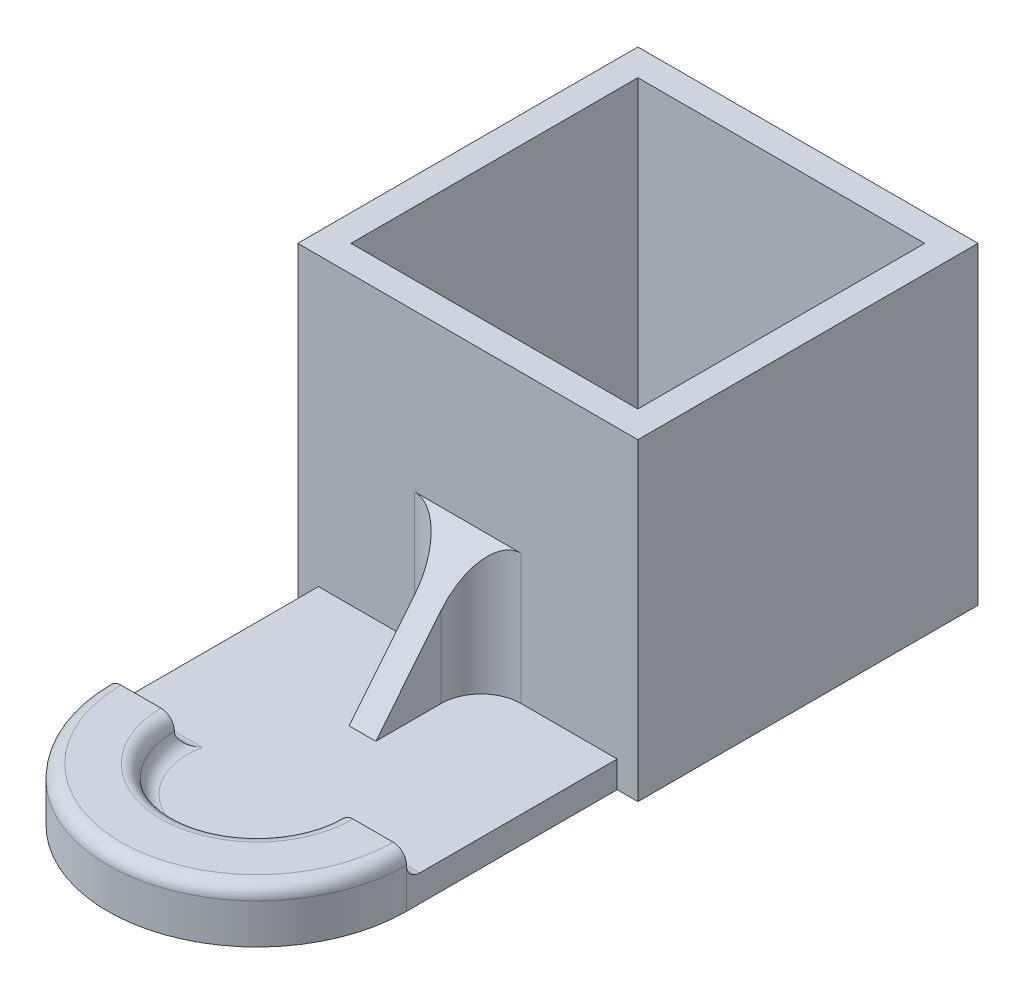
ISO-10303-21;
HEADER;
FILE_DESCRIPTION(('STEP AP214'),'2;1');
FILE_NAME('part.step','',(''),(''),'','','');
FILE_SCHEMA(('AUTOMOTIVE_DESIGN { 1 0 10303 214 1 1 1 1 }'));
ENDSEC;
DATA;
#1=APPLICATION_CONTEXT('core data for automotive mechanical design processes');
#2=APPLICATION_PROTOCOL_DEFINITION('international standard','automotive_design',2000,#1);
#3=PRODUCT_CONTEXT('',#1,'mechanical');
#4=PRODUCT('Part','Part','',(#3));
#5=PRODUCT_RELATED_PRODUCT_CATEGORY('part','',(#4));
#6=PRODUCT_DEFINITION_FORMATION('','',#4);
#7=PRODUCT_DEFINITION_CONTEXT('part definition',#1,'design');
#8=PRODUCT_DEFINITION('design','',#6,#7);
#9=PRODUCT_DEFINITION_SHAPE('','',#8);
#10=(LENGTH_UNIT() NAMED_UNIT(*) SI_UNIT(.MILLI.,.METRE.));
#11=(NAMED_UNIT(*) PLANE_ANGLE_UNIT() SI_UNIT($,.RADIAN.));
#12=(NAMED_UNIT(*) SI_UNIT($,.STERADIAN.) SOLID_ANGLE_UNIT());
#13=UNCERTAINTY_MEASURE_WITH_UNIT(LENGTH_MEASURE(1.E-05),#10,'distance_accuracy_value','');
#14=(GEOMETRIC_REPRESENTATION_CONTEXT(3) GLOBAL_UNCERTAINTY_ASSIGNED_CONTEXT((#13)) GLOBAL_UNIT_ASSIGNED_CONTEXT((#10,
#11,#12)) REPRESENTATION_CONTEXT('',''));
#15=CARTESIAN_POINT('',(0.,0.,0.));
#16=DIRECTION('',(0.,0.,1.));
#17=DIRECTION('',(1.,0.,0.));
#18=AXIS2_PLACEMENT_3D('',#15,#16,#17);
#19=CARTESIAN_POINT('',(0.,21.5443469,2.));
#20=DIRECTION('',(0.,0.,-1.));
#21=DIRECTION('',(-1.,0.,0.));
#22=AXIS2_PLACEMENT_3D('',#19,#20,#21);
#23=PLANE('',#22);
#24=DIRECTION('',(-1.,0.,0.));
#25=VECTOR('',#24,1.);
#26=CARTESIAN_POINT('',(11.77217345,9.77217345,2.));
#27=LINE('',#26,#25);
#28=CARTESIAN_POINT('',(14.77217345,9.77217345,2.));
#29=VERTEX_POINT('',#28);
#30=CARTESIAN_POINT('',(6.77217345,9.77217345,2.));
#31=VERTEX_POINT('',#30);
#32=EDGE_CURVE('E232',#29,#31,#27,.T.);
#33=ORIENTED_EDGE('',*,*,#32,.F.);
#34=DIRECTION('',(0.,1.,0.));
#35=VECTOR('',#34,1.);
#36=CARTESIAN_POINT('',(14.77217345,0.,2.));
#37=LINE('',#36,#35);
#38=CARTESIAN_POINT('',(14.77217345,0.,2.));
#39=VERTEX_POINT('',#38);
#40=EDGE_CURVE('E374',#29,#39,#37,.F.);
#41=ORIENTED_EDGE('',*,*,#40,.T.);
#42=DIRECTION('',(-1.,0.,0.));
#43=VECTOR('',#42,1.);
#44=CARTESIAN_POINT('',(0.,0.,2.));
#45=LINE('',#44,#43);
#46=CARTESIAN_POINT('',(21.9876055524861,0.,2.));
#47=VERTEX_POINT('',#46);
#48=EDGE_CURVE('E365',#47,#39,#45,.T.);
#49=ORIENTED_EDGE('',*,*,#48,.F.);
#50=DIRECTION('',(0.,-1.,0.));
#51=VECTOR('',#50,1.);
#52=CARTESIAN_POINT('',(21.9876055524861,0.,2.));
#53=LINE('',#52,#51);
#54=CARTESIAN_POINT('',(21.9876055524861,-2.,2.));
#55=VERTEX_POINT('',#54);
#56=EDGE_CURVE('E258',#47,#55,#53,.T.);
#57=ORIENTED_EDGE('',*,*,#56,.T.);
#58=DIRECTION('',(-1.,0.,0.));
#59=VECTOR('',#58,1.);
#60=CARTESIAN_POINT('',(23.5443469,-2.,2.));
#61=LINE('',#60,#59);
#62=CARTESIAN_POINT('',(23.5443469,-2.,2.));
#63=VERTEX_POINT('',#62);
#64=EDGE_CURVE('E281',#63,#55,#61,.T.);
#65=ORIENTED_EDGE('',*,*,#64,.F.);
#66=DIRECTION('',(0.,-1.,0.));
#67=VECTOR('',#66,1.);
#68=CARTESIAN_POINT('',(23.5443469,21.5443469,2.));
#69=LINE('',#68,#67);
#70=CARTESIAN_POINT('',(23.5443469,21.5443469,2.));
#71=VERTEX_POINT('',#70);
#72=EDGE_CURVE('E357',#71,#63,#69,.T.);
#73=ORIENTED_EDGE('',*,*,#72,.F.);
#74=DIRECTION('',(1.,0.,0.));
#75=VECTOR('',#74,1.);
#76=CARTESIAN_POINT('',(0.,21.5443469,2.));
#77=LINE('',#76,#75);
#78=CARTESIAN_POINT('',(-2.,21.5443469,2.));
#79=VERTEX_POINT('',#78);
#80=EDGE_CURVE('E342',#79,#71,#77,.T.);
#81=ORIENTED_EDGE('',*,*,#80,.F.);
#82=DIRECTION('',(0.,-1.,0.));
#83=VECTOR('',#82,1.);
#84=CARTESIAN_POINT('',(-2.,21.5443469,2.));
#85=LINE('',#84,#83);
#86=CARTESIAN_POINT('',(-2.,-2.,2.));
#87=VERTEX_POINT('',#86);
#88=EDGE_CURVE('E360',#79,#87,#85,.T.);
#89=ORIENTED_EDGE('',*,*,#88,.T.);
#90=CARTESIAN_POINT('',(-0.443258652486052,-2.,2.));
#91=VERTEX_POINT('',#90);
#92=EDGE_CURVE('E272',#91,#87,#61,.T.);
#93=ORIENTED_EDGE('',*,*,#92,.F.);
#94=DIRECTION('',(0.,-1.,0.));
#95=VECTOR('',#94,1.);
#96=CARTESIAN_POINT('',(-0.443258652486053,0.,2.));
#97=LINE('',#96,#95);
#98=CARTESIAN_POINT('',(-0.443258652486053,0.,2.));
#99=VERTEX_POINT('',#98);
#100=EDGE_CURVE('E268',#99,#91,#97,.T.);
#101=ORIENTED_EDGE('',*,*,#100,.F.);
#102=CARTESIAN_POINT('',(6.77217345,0.,2.));
#103=VERTEX_POINT('',#102);
#104=EDGE_CURVE('E364',#103,#99,#45,.T.);
#105=ORIENTED_EDGE('',*,*,#104,.F.);
#106=DIRECTION('',(0.,1.,0.));
#107=VECTOR('',#106,1.);
#108=CARTESIAN_POINT('',(6.77217345,21.5443469,2.));
#109=LINE('',#108,#107);
#110=EDGE_CURVE('E370',#103,#31,#109,.T.);
#111=ORIENTED_EDGE('',*,*,#110,.T.);
#112=EDGE_LOOP('',(#33,#41,#49,#57,#65,#73,#81,#89,#93,#101,#105,#111));
#113=FACE_BOUND('',#112,.T.);
#114=ADVANCED_FACE('F63',(#113),#23,.F.);
#115=CARTESIAN_POINT('',(10.77217345,0.,2.));
#116=DIRECTION('',(0.,-1.,0.));
#117=DIRECTION('',(0.,0.,-1.));
#118=AXIS2_PLACEMENT_3D('',#115,#116,#117);
#119=PLANE('',#118);
#120=CARTESIAN_POINT('',(10.77217345,0.,17.8235518365));
#121=DIRECTION('',(0.,-1.,0.));
#122=DIRECTION('',(0.,0.,-1.));
#123=AXIS2_PLACEMENT_3D('',#120,#121,#122);
#124=CIRCLE('',#123,5.21543210248605);
#125=CARTESIAN_POINT('',(5.65350838812673,0.,16.8235518365));
#126=VERTEX_POINT('',#125);
#127=CARTESIAN_POINT('',(15.8908385118733,0.,16.8235518365));
#128=VERTEX_POINT('',#127);
#129=EDGE_CURVE('E391',#126,#128,#124,.F.);
#130=ORIENTED_EDGE('',*,*,#129,.T.);
#131=DIRECTION('',(1.,0.,0.));
#132=VECTOR('',#131,1.);
#133=CARTESIAN_POINT('',(10.77217345,0.,16.8235518365));
#134=LINE('',#133,#132);
#135=CARTESIAN_POINT('',(21.9876055524861,0.,16.8235518365));
#136=VERTEX_POINT('',#135);
#137=EDGE_CURVE('E397',#128,#136,#134,.T.);
#138=ORIENTED_EDGE('',*,*,#137,.T.);
#139=DIRECTION('',(0.,0.,1.));
#140=VECTOR('',#139,1.);
#141=CARTESIAN_POINT('',(21.9876055524861,0.,2.));
#142=LINE('',#141,#140);
#143=EDGE_CURVE('E250',#47,#136,#142,.T.);
#144=ORIENTED_EDGE('',*,*,#143,.F.);
#145=ORIENTED_EDGE('',*,*,#48,.T.);
#146=CARTESIAN_POINT('',(14.77217345,0.,5.));
#147=DIRECTION('',(0.,-1.,0.));
#148=DIRECTION('',(0.,0.,-1.));
#149=AXIS2_PLACEMENT_3D('',#146,#147,#148);
#150=CIRCLE('',#149,3.);
#151=CARTESIAN_POINT('',(11.77217345,0.,5.));
#152=VERTEX_POINT('',#151);
#153=EDGE_CURVE('E237',#39,#152,#150,.F.);
#154=ORIENTED_EDGE('',*,*,#153,.T.);
#155=DIRECTION('',(0.,0.,-1.));
#156=VECTOR('',#155,1.);
#157=CARTESIAN_POINT('',(11.77217345,0.,2.));
#158=LINE('',#157,#156);
#159=CARTESIAN_POINT('',(11.77217345,0.,9.91177591824999));
#160=VERTEX_POINT('',#159);
#161=EDGE_CURVE('E215',#160,#152,#158,.T.);
#162=ORIENTED_EDGE('',*,*,#161,.F.);
#163=DIRECTION('',(-1.,0.,0.));
#164=VECTOR('',#163,1.);
#165=CARTESIAN_POINT('',(11.77217345,0.,9.91177591824999));
#166=LINE('',#165,#164);
#167=CARTESIAN_POINT('',(9.77217345,0.,9.91177591824999));
#168=VERTEX_POINT('',#167);
#169=EDGE_CURVE('E224',#160,#168,#166,.T.);
#170=ORIENTED_EDGE('',*,*,#169,.T.);
#171=DIRECTION('',(0.,0.,-1.));
#172=VECTOR('',#171,1.);
#173=CARTESIAN_POINT('',(9.77217345,0.,2.));
#174=LINE('',#173,#172);
#175=CARTESIAN_POINT('',(9.77217345,0.,5.));
#176=VERTEX_POINT('',#175);
#177=EDGE_CURVE('E221',#168,#176,#174,.T.);
#178=ORIENTED_EDGE('',*,*,#177,.T.);
#179=CARTESIAN_POINT('',(6.77217345,0.,5.));
#180=DIRECTION('',(0.,-1.,0.));
#181=DIRECTION('',(0.,0.,-1.));
#182=AXIS2_PLACEMENT_3D('',#179,#180,#181);
#183=CIRCLE('',#182,3.);
#184=EDGE_CURVE('E377',#176,#103,#183,.F.);
#185=ORIENTED_EDGE('',*,*,#184,.T.);
#186=ORIENTED_EDGE('',*,*,#104,.T.);
#187=DIRECTION('',(0.,0.,-1.));
#188=VECTOR('',#187,1.);
#189=CARTESIAN_POINT('',(-0.443258652486053,0.,2.));
#190=LINE('',#189,#188);
#191=CARTESIAN_POINT('',(-0.443258652486053,0.,16.8235518365));
#192=VERTEX_POINT('',#191);
#193=EDGE_CURVE('E254',#192,#99,#190,.T.);
#194=ORIENTED_EDGE('',*,*,#193,.F.);
#195=DIRECTION('',(1.,0.,0.));
#196=VECTOR('',#195,1.);
#197=CARTESIAN_POINT('',(10.77217345,0.,16.8235518365));
#198=LINE('',#197,#196);
#199=EDGE_CURVE('E394',#192,#126,#198,.T.);
#200=ORIENTED_EDGE('',*,*,#199,.T.);
#201=EDGE_LOOP('',(#130,#138,#144,#145,#154,#162,#170,#178,#185,#186,#194,#200));
#202=FACE_BOUND('',#201,.T.);
#203=ADVANCED_FACE('F234',(#202),#119,.F.);
#204=CARTESIAN_POINT('',(0.,21.5443469,0.));
#205=DIRECTION('',(0.,1.,0.));
#206=DIRECTION('',(0.,0.,1.));
#207=AXIS2_PLACEMENT_3D('',#204,#205,#206);
#208=PLANE('',#207);
#209=DIRECTION('',(0.,0.,1.));
#210=VECTOR('',#209,1.);
#211=CARTESIAN_POINT('',(-2.,21.5443469,0.));
#212=LINE('',#211,#210);
#213=CARTESIAN_POINT('',(-2.,21.5443469,-23.5443469));
#214=VERTEX_POINT('',#213);
#215=EDGE_CURVE('E338',#214,#79,#212,.T.);
#216=ORIENTED_EDGE('',*,*,#215,.T.);
#217=ORIENTED_EDGE('',*,*,#80,.T.);
#218=DIRECTION('',(0.,0.,-1.));
#219=VECTOR('',#218,1.);
#220=CARTESIAN_POINT('',(23.5443469,21.5443469,0.));
#221=LINE('',#220,#219);
#222=CARTESIAN_POINT('',(23.5443469,21.5443469,-23.5443469));
#223=VERTEX_POINT('',#222);
#224=EDGE_CURVE('E345',#71,#223,#221,.T.);
#225=ORIENTED_EDGE('',*,*,#224,.T.);
#226=DIRECTION('',(-1.,0.,0.));
#227=VECTOR('',#226,1.);
#228=CARTESIAN_POINT('',(0.,21.5443469,-23.5443469));
#229=LINE('',#228,#227);
#230=EDGE_CURVE('E348',#223,#214,#229,.T.);
#231=ORIENTED_EDGE('',*,*,#230,.T.);
#232=EDGE_LOOP('',(#216,#217,#225,#231));
#233=FACE_BOUND('',#232,.T.);
#234=DIRECTION('',(1.,0.,0.));
#235=VECTOR('',#234,1.);
#236=CARTESIAN_POINT('',(0.,21.5443469,0.));
#237=LINE('',#236,#235);
#238=CARTESIAN_POINT('',(0.,21.5443469,0.));
#239=VERTEX_POINT('',#238);
#240=CARTESIAN_POINT('',(21.5443469,21.5443469,0.));
#241=VERTEX_POINT('',#240);
#242=EDGE_CURVE('E301',#239,#241,#237,.T.);
#243=ORIENTED_EDGE('',*,*,#242,.F.);
#244=DIRECTION('',(0.,0.,1.));
#245=VECTOR('',#244,1.);
#246=CARTESIAN_POINT('',(0.,21.5443469,0.));
#247=LINE('',#246,#245);
#248=CARTESIAN_POINT('',(0.,21.5443469,-21.5443469));
#249=VERTEX_POINT('',#248);
#250=EDGE_CURVE('E298',#249,#239,#247,.T.);
#251=ORIENTED_EDGE('',*,*,#250,.F.);
#252=DIRECTION('',(-1.,0.,0.));
#253=VECTOR('',#252,1.);
#254=CARTESIAN_POINT('',(0.,21.5443469,-21.5443469));
#255=LINE('',#254,#253);
#256=CARTESIAN_POINT('',(21.5443469,21.5443469,-21.5443469));
#257=VERTEX_POINT('',#256);
#258=EDGE_CURVE('E309',#257,#249,#255,.T.);
#259=ORIENTED_EDGE('',*,*,#258,.F.);
#260=DIRECTION('',(0.,0.,-1.));
#261=VECTOR('',#260,1.);
#262=CARTESIAN_POINT('',(21.5443469,21.5443469,0.));
#263=LINE('',#262,#261);
#264=EDGE_CURVE('E305',#241,#257,#263,.T.);
#265=ORIENTED_EDGE('',*,*,#264,.F.);
#266=EDGE_LOOP('',(#243,#251,#259,#265));
#267=FACE_BOUND('',#266,.T.);
#268=ADVANCED_FACE('F476',(#233,#267),#208,.T.);
#269=CARTESIAN_POINT('',(-2.,21.5443469,0.));
#270=DIRECTION('',(1.,0.,0.));
#271=DIRECTION('',(0.,0.,-1.));
#272=AXIS2_PLACEMENT_3D('',#269,#270,#271);
#273=PLANE('',#272);
#274=DIRECTION('',(0.,-1.,0.));
#275=VECTOR('',#274,1.);
#276=CARTESIAN_POINT('',(-2.,21.5443469,-23.5443469));
#277=LINE('',#276,#275);
#278=CARTESIAN_POINT('',(-2.,-2.,-23.5443469));
#279=VERTEX_POINT('',#278);
#280=EDGE_CURVE('E351',#214,#279,#277,.T.);
#281=ORIENTED_EDGE('',*,*,#280,.T.);
#282=DIRECTION('',(0.,0.,-1.));
#283=VECTOR('',#282,1.);
#284=CARTESIAN_POINT('',(-2.,-2.,2.));
#285=LINE('',#284,#283);
#286=EDGE_CURVE('E285',#87,#279,#285,.T.);
#287=ORIENTED_EDGE('',*,*,#286,.F.);
#288=ORIENTED_EDGE('',*,*,#88,.F.);
#289=ORIENTED_EDGE('',*,*,#215,.F.);
#290=EDGE_LOOP('',(#281,#287,#288,#289));
#291=FACE_BOUND('',#290,.T.);
#292=ADVANCED_FACE('F482',(#291),#273,.F.);
#293=CARTESIAN_POINT('',(23.5443469,21.5443469,0.));
#294=DIRECTION('',(-1.,0.,0.));
#295=DIRECTION('',(0.,0.,1.));
#296=AXIS2_PLACEMENT_3D('',#293,#294,#295);
#297=PLANE('',#296);
#298=ORIENTED_EDGE('',*,*,#72,.T.);
#299=DIRECTION('',(0.,0.,1.));
#300=VECTOR('',#299,1.);
#301=CARTESIAN_POINT('',(23.5443469,-2.,-23.5443469));
#302=LINE('',#301,#300);
#303=CARTESIAN_POINT('',(23.5443469,-2.,-23.5443469));
#304=VERTEX_POINT('',#303);
#305=EDGE_CURVE('E293',#304,#63,#302,.T.);
#306=ORIENTED_EDGE('',*,*,#305,.F.);
#307=DIRECTION('',(0.,-1.,0.));
#308=VECTOR('',#307,1.);
#309=CARTESIAN_POINT('',(23.5443469,21.5443469,-23.5443469));
#310=LINE('',#309,#308);
#311=EDGE_CURVE('E354',#223,#304,#310,.T.);
#312=ORIENTED_EDGE('',*,*,#311,.F.);
#313=ORIENTED_EDGE('',*,*,#224,.F.);
#314=EDGE_LOOP('',(#298,#306,#312,#313));
#315=FACE_BOUND('',#314,.T.);
#316=ADVANCED_FACE('F480',(#315),#297,.F.);
#317=CARTESIAN_POINT('',(0.,21.5443469,-23.5443469));
#318=DIRECTION('',(0.,0.,1.));
#319=DIRECTION('',(1.,0.,0.));
#320=AXIS2_PLACEMENT_3D('',#317,#318,#319);
#321=PLANE('',#320);
#322=ORIENTED_EDGE('',*,*,#311,.T.);
#323=DIRECTION('',(1.,0.,0.));
#324=VECTOR('',#323,1.);
#325=CARTESIAN_POINT('',(-2.,-2.,-23.5443469));
#326=LINE('',#325,#324);
#327=EDGE_CURVE('E289',#279,#304,#326,.T.);
#328=ORIENTED_EDGE('',*,*,#327,.F.);
#329=ORIENTED_EDGE('',*,*,#280,.F.);
#330=ORIENTED_EDGE('',*,*,#230,.F.);
#331=EDGE_LOOP('',(#322,#328,#329,#330));
#332=FACE_BOUND('',#331,.T.);
#333=ADVANCED_FACE('F521',(#332),#321,.F.);
#334=CARTESIAN_POINT('',(0.,21.5443469,0.));
#335=DIRECTION('',(1.,0.,0.));
#336=DIRECTION('',(0.,0.,-1.));
#337=AXIS2_PLACEMENT_3D('',#334,#335,#336);
#338=PLANE('',#337);
#339=DIRECTION('',(0.,0.,1.));
#340=VECTOR('',#339,1.);
#341=CARTESIAN_POINT('',(0.,0.,0.));
#342=LINE('',#341,#340);
#343=CARTESIAN_POINT('',(0.,0.,-21.5443469));
#344=VERTEX_POINT('',#343);
#345=CARTESIAN_POINT('',(0.,0.,0.));
#346=VERTEX_POINT('',#345);
#347=EDGE_CURVE('E297',#344,#346,#342,.T.);
#348=ORIENTED_EDGE('',*,*,#347,.F.);
#349=DIRECTION('',(0.,-1.,0.));
#350=VECTOR('',#349,1.);
#351=CARTESIAN_POINT('',(0.,21.5443469,-21.5443469));
#352=LINE('',#351,#350);
#353=EDGE_CURVE('E312',#249,#344,#352,.T.);
#354=ORIENTED_EDGE('',*,*,#353,.F.);
#355=ORIENTED_EDGE('',*,*,#250,.T.);
#356=DIRECTION('',(0.,-1.,0.));
#357=VECTOR('',#356,1.);
#358=CARTESIAN_POINT('',(0.,21.5443469,0.));
#359=LINE('',#358,#357);
#360=EDGE_CURVE('E334',#239,#346,#359,.T.);
#361=ORIENTED_EDGE('',*,*,#360,.T.);
#362=EDGE_LOOP('',(#348,#354,#355,#361));
#363=FACE_BOUND('',#362,.T.);
#364=ADVANCED_FACE('F599',(#363),#338,.T.);
#365=CARTESIAN_POINT('',(0.,21.5443469,0.));
#366=DIRECTION('',(0.,0.,-1.));
#367=DIRECTION('',(-1.,0.,0.));
#368=AXIS2_PLACEMENT_3D('',#365,#366,#367);
#369=PLANE('',#368);
#370=DIRECTION('',(1.,0.,0.));
#371=VECTOR('',#370,1.);
#372=CARTESIAN_POINT('',(0.,0.,0.));
#373=LINE('',#372,#371);
#374=CARTESIAN_POINT('',(21.5443469,0.,0.));
#375=VERTEX_POINT('',#374);
#376=EDGE_CURVE('E315',#346,#375,#373,.T.);
#377=ORIENTED_EDGE('',*,*,#376,.F.);
#378=ORIENTED_EDGE('',*,*,#360,.F.);
#379=ORIENTED_EDGE('',*,*,#242,.T.);
#380=DIRECTION('',(0.,-1.,0.));
#381=VECTOR('',#380,1.);
#382=CARTESIAN_POINT('',(21.5443469,21.5443469,0.));
#383=LINE('',#382,#381);
#384=EDGE_CURVE('E331',#241,#375,#383,.T.);
#385=ORIENTED_EDGE('',*,*,#384,.T.);
#386=EDGE_LOOP('',(#377,#378,#379,#385));
#387=FACE_BOUND('',#386,.T.);
#388=ADVANCED_FACE('F595',(#387),#369,.T.);
#389=CARTESIAN_POINT('',(21.5443469,21.5443469,0.));
#390=DIRECTION('',(-1.,0.,0.));
#391=DIRECTION('',(0.,0.,1.));
#392=AXIS2_PLACEMENT_3D('',#389,#390,#391);
#393=PLANE('',#392);
#394=DIRECTION('',(0.,0.,-1.));
#395=VECTOR('',#394,1.);
#396=CARTESIAN_POINT('',(21.5443469,0.,0.));
#397=LINE('',#396,#395);
#398=CARTESIAN_POINT('',(21.5443469,0.,-21.5443469));
#399=VERTEX_POINT('',#398);
#400=EDGE_CURVE('E319',#375,#399,#397,.T.);
#401=ORIENTED_EDGE('',*,*,#400,.F.);
#402=ORIENTED_EDGE('',*,*,#384,.F.);
#403=ORIENTED_EDGE('',*,*,#264,.T.);
#404=DIRECTION('',(0.,-1.,0.));
#405=VECTOR('',#404,1.);
#406=CARTESIAN_POINT('',(21.5443469,21.5443469,-21.5443469));
#407=LINE('',#406,#405);
#408=EDGE_CURVE('E327',#257,#399,#407,.T.);
#409=ORIENTED_EDGE('',*,*,#408,.T.);
#410=EDGE_LOOP('',(#401,#402,#403,#409));
#411=FACE_BOUND('',#410,.T.);
#412=ADVANCED_FACE('F591',(#411),#393,.T.);
#413=CARTESIAN_POINT('',(0.,21.5443469,-21.5443469));
#414=DIRECTION('',(0.,0.,1.));
#415=DIRECTION('',(1.,0.,0.));
#416=AXIS2_PLACEMENT_3D('',#413,#414,#415);
#417=PLANE('',#416);
#418=DIRECTION('',(-1.,0.,0.));
#419=VECTOR('',#418,1.);
#420=CARTESIAN_POINT('',(0.,0.,-21.5443469));
#421=LINE('',#420,#419);
#422=EDGE_CURVE('E302',#399,#344,#421,.T.);
#423=ORIENTED_EDGE('',*,*,#422,.F.);
#424=ORIENTED_EDGE('',*,*,#408,.F.);
#425=ORIENTED_EDGE('',*,*,#258,.T.);
#426=ORIENTED_EDGE('',*,*,#353,.T.);
#427=EDGE_LOOP('',(#423,#424,#425,#426));
#428=FACE_BOUND('',#427,.T.);
#429=ADVANCED_FACE('F587',(#428),#417,.T.);
#430=CARTESIAN_POINT('',(0.,0.,0.));
#431=DIRECTION('',(0.,-1.,0.));
#432=DIRECTION('',(0.,0.,-1.));
#433=AXIS2_PLACEMENT_3D('',#430,#431,#432);
#434=PLANE('',#433);
#435=ORIENTED_EDGE('',*,*,#347,.T.);
#436=ORIENTED_EDGE('',*,*,#376,.T.);
#437=ORIENTED_EDGE('',*,*,#400,.T.);
#438=ORIENTED_EDGE('',*,*,#422,.T.);
#439=EDGE_LOOP('',(#435,#436,#437,#438));
#440=FACE_BOUND('',#439,.T.);
#441=ADVANCED_FACE('F584',(#440),#434,.F.);
#442=CARTESIAN_POINT('',(0.,-2.,0.));
#443=DIRECTION('',(0.,-1.,0.));
#444=DIRECTION('',(0.,0.,-1.));
#445=AXIS2_PLACEMENT_3D('',#442,#443,#444);
#446=PLANE('',#445);
#447=ORIENTED_EDGE('',*,*,#64,.T.);
#448=DIRECTION('',(0.,0.,1.));
#449=VECTOR('',#448,1.);
#450=CARTESIAN_POINT('',(21.9876055524861,-2.,2.));
#451=LINE('',#450,#449);
#452=CARTESIAN_POINT('',(21.9876055524861,-2.,17.8235518365));
#453=VERTEX_POINT('',#452);
#454=EDGE_CURVE('E249',#55,#453,#451,.T.);
#455=ORIENTED_EDGE('',*,*,#454,.T.);
#456=CARTESIAN_POINT('',(10.77217345,-2.,17.8235518365));
#457=DIRECTION('',(0.,-1.,0.));
#458=DIRECTION('',(0.,0.,-1.));
#459=AXIS2_PLACEMENT_3D('',#456,#457,#458);
#460=CIRCLE('',#459,11.2154321024861);
#461=CARTESIAN_POINT('',(-0.443258652486053,-2.,17.8235518365));
#462=VERTEX_POINT('',#461);
#463=EDGE_CURVE('E262',#453,#462,#460,.T.);
#464=ORIENTED_EDGE('',*,*,#463,.T.);
#465=DIRECTION('',(0.,0.,-1.));
#466=VECTOR('',#465,1.);
#467=CARTESIAN_POINT('',(-0.443258652486053,-2.,2.));
#468=LINE('',#467,#466);
#469=EDGE_CURVE('E255',#462,#91,#468,.T.);
#470=ORIENTED_EDGE('',*,*,#469,.T.);
#471=ORIENTED_EDGE('',*,*,#92,.T.);
#472=ORIENTED_EDGE('',*,*,#286,.T.);
#473=ORIENTED_EDGE('',*,*,#327,.T.);
#474=ORIENTED_EDGE('',*,*,#305,.T.);
#475=EDGE_LOOP('',(#447,#455,#464,#470,#471,#472,#473,#474));
#476=FACE_BOUND('',#475,.T.);
#477=ADVANCED_FACE('F511',(#476),#446,.T.);
#478=CARTESIAN_POINT('',(-0.443258652486053,0.,2.));
#479=DIRECTION('',(-1.,0.,0.));
#480=DIRECTION('',(0.,0.,1.));
#481=AXIS2_PLACEMENT_3D('',#478,#479,#480);
#482=PLANE('',#481);
#483=ORIENTED_EDGE('',*,*,#469,.F.);
#484=DIRECTION('',(0.,-1.,0.));
#485=VECTOR('',#484,1.);
#486=CARTESIAN_POINT('',(-0.443258652486053,0.,17.8235518365));
#487=LINE('',#486,#485);
#488=CARTESIAN_POINT('',(-0.443258652486053,1.,17.8235518365));
#489=VERTEX_POINT('',#488);
#490=EDGE_CURVE('E273',#489,#462,#487,.T.);
#491=ORIENTED_EDGE('',*,*,#490,.F.);
#492=CARTESIAN_POINT('',(-0.443258652486053,1.,16.8235518365));
#493=DIRECTION('',(-1.,0.,0.));
#494=DIRECTION('',(0.,0.,1.));
#495=AXIS2_PLACEMENT_3D('',#492,#493,#494);
#496=CIRCLE('',#495,1.);
#497=EDGE_CURVE('E12',#489,#192,#496,.F.);
#498=ORIENTED_EDGE('',*,*,#497,.T.);
#499=ORIENTED_EDGE('',*,*,#193,.T.);
#500=ORIENTED_EDGE('',*,*,#100,.T.);
#501=EDGE_LOOP('',(#483,#491,#498,#499,#500));
#502=FACE_BOUND('',#501,.T.);
#503=ADVANCED_FACE('F536',(#502),#482,.T.);
#504=CARTESIAN_POINT('',(10.77217345,0.,17.8235518365));
#505=DIRECTION('',(0.,-1.,0.));
#506=DIRECTION('',(0.,0.,-1.));
#507=AXIS2_PLACEMENT_3D('',#504,#505,#506);
#508=CYLINDRICAL_SURFACE('',#507,11.2154321024861);
#509=DIRECTION('',(0.,-1.,0.));
#510=VECTOR('',#509,1.);
#511=CARTESIAN_POINT('',(21.9876055524861,0.,17.8235518365));
#512=LINE('',#511,#510);
#513=CARTESIAN_POINT('',(21.9876055524861,1.,17.8235518365));
#514=VERTEX_POINT('',#513);
#515=EDGE_CURVE('E82',#514,#453,#512,.T.);
#516=ORIENTED_EDGE('',*,*,#515,.F.);
#517=CARTESIAN_POINT('',(10.77217345,1.,17.8235518365));
#518=DIRECTION('',(0.,1.,0.));
#519=DIRECTION('',(0.,0.,1.));
#520=AXIS2_PLACEMENT_3D('',#517,#518,#519);
#521=CIRCLE('',#520,11.2154321024861);
#522=EDGE_CURVE('E427',#514,#489,#521,.F.);
#523=ORIENTED_EDGE('',*,*,#522,.T.);
#524=ORIENTED_EDGE('',*,*,#490,.T.);
#525=ORIENTED_EDGE('',*,*,#463,.F.);
#526=EDGE_LOOP('',(#516,#523,#524,#525));
#527=FACE_BOUND('',#526,.T.);
#528=ADVANCED_FACE('F532',(#527),#508,.T.);
#529=CARTESIAN_POINT('',(21.9876055524861,0.,2.));
#530=DIRECTION('',(1.,0.,0.));
#531=DIRECTION('',(0.,0.,-1.));
#532=AXIS2_PLACEMENT_3D('',#529,#530,#531);
#533=PLANE('',#532);
#534=ORIENTED_EDGE('',*,*,#454,.F.);
#535=ORIENTED_EDGE('',*,*,#56,.F.);
#536=ORIENTED_EDGE('',*,*,#143,.T.);
#537=CARTESIAN_POINT('',(21.9876055524861,1.,16.8235518365));
#538=DIRECTION('',(1.,0.,0.));
#539=DIRECTION('',(0.,0.,-1.));
#540=AXIS2_PLACEMENT_3D('',#537,#538,#539);
#541=CIRCLE('',#540,1.);
#542=EDGE_CURVE('E74',#136,#514,#541,.F.);
#543=ORIENTED_EDGE('',*,*,#542,.T.);
#544=ORIENTED_EDGE('',*,*,#515,.T.);
#545=EDGE_LOOP('',(#534,#535,#536,#543,#544));
#546=FACE_BOUND('',#545,.T.);
#547=ADVANCED_FACE('F529',(#546),#533,.T.);
#548=CARTESIAN_POINT('',(11.77217345,9.77217345,2.));
#549=DIRECTION('',(0.,-0.629244776853764,-0.77720718653539));
#550=DIRECTION('',(0.,0.77720718653539,-0.629244776853764));
#551=AXIS2_PLACEMENT_3D('',#548,#549,#550);
#552=PLANE('',#551);
#553=ORIENTED_EDGE('',*,*,#32,.T.);
#554=CARTESIAN_POINT('',(6.77217345,6.06674490236179,5.));
#555=DIRECTION('',(0.,-0.629244776853764,-0.77720718653539));
#556=DIRECTION('',(0.,0.77720718653539,-0.629244776853764));
#557=AXIS2_PLACEMENT_3D('',#554,#555,#556);
#558=ELLIPSE('',#557,4.7676200269791,3.);
#559=CARTESIAN_POINT('',(9.77217345,6.06674490236179,5.));
#560=VERTEX_POINT('',#559);
#561=EDGE_CURVE('E388',#31,#560,#558,.T.);
#562=ORIENTED_EDGE('',*,*,#561,.T.);
#563=DIRECTION('',(0.,-0.77720718653539,0.629244776853764));
#564=VECTOR('',#563,1.);
#565=CARTESIAN_POINT('',(9.77217345,9.77217345,2.));
#566=LINE('',#565,#564);
#567=EDGE_CURVE('E227',#560,#168,#566,.T.);
#568=ORIENTED_EDGE('',*,*,#567,.T.);
#569=ORIENTED_EDGE('',*,*,#169,.F.);
#570=DIRECTION('',(0.,-0.77720718653539,0.629244776853764));
#571=VECTOR('',#570,1.);
#572=CARTESIAN_POINT('',(11.77217345,9.77217345,2.));
#573=LINE('',#572,#571);
#574=CARTESIAN_POINT('',(11.77217345,6.06674490236179,5.));
#575=VERTEX_POINT('',#574);
#576=EDGE_CURVE('E211',#575,#160,#573,.T.);
#577=ORIENTED_EDGE('',*,*,#576,.F.);
#578=CARTESIAN_POINT('',(14.77217345,6.06674490236179,5.));
#579=DIRECTION('',(0.,-0.629244776853764,-0.77720718653539));
#580=DIRECTION('',(0.,-0.77720718653539,0.629244776853764));
#581=AXIS2_PLACEMENT_3D('',#578,#579,#580);
#582=ELLIPSE('',#581,4.7676200269791,3.);
#583=EDGE_CURVE('E385',#575,#29,#582,.T.);
#584=ORIENTED_EDGE('',*,*,#583,.T.);
#585=EDGE_LOOP('',(#553,#562,#568,#569,#577,#584));
#586=FACE_BOUND('',#585,.T.);
#587=ADVANCED_FACE('F225',(#586),#552,.F.);
#588=CARTESIAN_POINT('',(11.77217345,0.,0.));
#589=DIRECTION('',(-1.,0.,0.));
#590=DIRECTION('',(0.,0.,1.));
#591=AXIS2_PLACEMENT_3D('',#588,#589,#590);
#592=PLANE('',#591);
#593=ORIENTED_EDGE('',*,*,#161,.T.);
#594=DIRECTION('',(0.,1.,0.));
#595=VECTOR('',#594,1.);
#596=CARTESIAN_POINT('',(11.77217345,9.77217345,5.));
#597=LINE('',#596,#595);
#598=EDGE_CURVE('E217',#152,#575,#597,.T.);
#599=ORIENTED_EDGE('',*,*,#598,.T.);
#600=ORIENTED_EDGE('',*,*,#576,.T.);
#601=EDGE_LOOP('',(#593,#599,#600));
#602=FACE_BOUND('',#601,.T.);
#603=ADVANCED_FACE('F213',(#602),#592,.F.);
#604=CARTESIAN_POINT('',(9.77217345,0.,0.));
#605=DIRECTION('',(-1.,0.,0.));
#606=DIRECTION('',(0.,0.,1.));
#607=AXIS2_PLACEMENT_3D('',#604,#605,#606);
#608=PLANE('',#607);
#609=ORIENTED_EDGE('',*,*,#567,.F.);
#610=DIRECTION('',(0.,1.,0.));
#611=VECTOR('',#610,1.);
#612=CARTESIAN_POINT('',(9.77217345,0.,5.));
#613=LINE('',#612,#611);
#614=EDGE_CURVE('E382',#560,#176,#613,.F.);
#615=ORIENTED_EDGE('',*,*,#614,.T.);
#616=ORIENTED_EDGE('',*,*,#177,.F.);
#617=EDGE_LOOP('',(#609,#615,#616));
#618=FACE_BOUND('',#617,.T.);
#619=ADVANCED_FACE('F489',(#618),#608,.T.);
#620=CARTESIAN_POINT('',(14.77217345,0.,5.));
#621=DIRECTION('',(0.,-1.,0.));
#622=DIRECTION('',(0.,0.,-1.));
#623=AXIS2_PLACEMENT_3D('',#620,#621,#622);
#624=CYLINDRICAL_SURFACE('',#623,3.);
#625=ORIENTED_EDGE('',*,*,#153,.F.);
#626=ORIENTED_EDGE('',*,*,#40,.F.);
#627=ORIENTED_EDGE('',*,*,#583,.F.);
#628=ORIENTED_EDGE('',*,*,#598,.F.);
#629=EDGE_LOOP('',(#625,#626,#627,#628));
#630=FACE_BOUND('',#629,.T.);
#631=ADVANCED_FACE('F486',(#630),#624,.F.);
#632=CARTESIAN_POINT('',(6.77217345,21.5443469,5.));
#633=DIRECTION('',(0.,1.,0.));
#634=DIRECTION('',(0.,0.,1.));
#635=AXIS2_PLACEMENT_3D('',#632,#633,#634);
#636=CYLINDRICAL_SURFACE('',#635,3.);
#637=ORIENTED_EDGE('',*,*,#184,.F.);
#638=ORIENTED_EDGE('',*,*,#614,.F.);
#639=ORIENTED_EDGE('',*,*,#561,.F.);
#640=ORIENTED_EDGE('',*,*,#110,.F.);
#641=EDGE_LOOP('',(#637,#638,#639,#640));
#642=FACE_BOUND('',#641,.T.);
#643=ADVANCED_FACE('F488',(#642),#636,.F.);
#644=CARTESIAN_POINT('',(16.987605552486,2.,17.8235518365));
#645=DIRECTION('',(0.,0.,-1.));
#646=DIRECTION('',(-1.,0.,0.));
#647=AXIS2_PLACEMENT_3D('',#644,#645,#646);
#648=PLANE('',#647);
#649=DIRECTION('',(1.,0.,0.));
#650=VECTOR('',#649,1.);
#651=CARTESIAN_POINT('',(16.987605552486,2.,17.8235518365));
#652=LINE('',#651,#650);
#653=CARTESIAN_POINT('',(17.9876055524861,2.,17.8235518365));
#654=VERTEX_POINT('',#653);
#655=CARTESIAN_POINT('',(20.987605552486,2.,17.8235518365));
#656=VERTEX_POINT('',#655);
#657=EDGE_CURVE('E560',#654,#656,#652,.T.);
#658=ORIENTED_EDGE('',*,*,#657,.T.);
#659=CARTESIAN_POINT('',(20.987605552486,1.,17.8235518365));
#660=DIRECTION('',(0.,0.,-1.));
#661=DIRECTION('',(-1.,0.,0.));
#662=AXIS2_PLACEMENT_3D('',#659,#660,#661);
#663=CIRCLE('',#662,1.);
#664=EDGE_CURVE('E407',#656,#514,#663,.T.);
#665=ORIENTED_EDGE('',*,*,#664,.T.);
#666=DIRECTION('',(1.,0.,0.));
#667=VECTOR('',#666,1.);
#668=CARTESIAN_POINT('',(16.987605552486,1.,17.8235518365));
#669=LINE('',#668,#667);
#670=CARTESIAN_POINT('',(16.987605552486,1.,17.8235518365));
#671=VERTEX_POINT('',#670);
#672=EDGE_CURVE('E404',#514,#671,#669,.F.);
#673=ORIENTED_EDGE('',*,*,#672,.T.);
#674=CARTESIAN_POINT('',(17.9876055524861,1.,17.8235518365));
#675=DIRECTION('',(0.,0.,-1.));
#676=DIRECTION('',(-1.,0.,0.));
#677=AXIS2_PLACEMENT_3D('',#674,#675,#676);
#678=CIRCLE('',#677,1.);
#679=EDGE_CURVE('E401',#671,#654,#678,.T.);
#680=ORIENTED_EDGE('',*,*,#679,.T.);
#681=EDGE_LOOP('',(#658,#665,#673,#680));
#682=FACE_BOUND('',#681,.T.);
#683=ADVANCED_FACE('F492',(#682),#648,.T.);
#684=CARTESIAN_POINT('',(-0.443258652486053,2.,17.8235518365));
#685=DIRECTION('',(0.,0.,-1.));
#686=DIRECTION('',(-1.,0.,0.));
#687=AXIS2_PLACEMENT_3D('',#684,#685,#686);
#688=PLANE('',#687);
#689=DIRECTION('',(1.,0.,0.));
#690=VECTOR('',#689,1.);
#691=CARTESIAN_POINT('',(-0.443258652486053,1.,17.8235518365));
#692=LINE('',#691,#690);
#693=CARTESIAN_POINT('',(4.55674134751395,1.,17.8235518365));
#694=VERTEX_POINT('',#693);
#695=EDGE_CURVE('E413',#694,#489,#692,.F.);
#696=ORIENTED_EDGE('',*,*,#695,.T.);
#697=CARTESIAN_POINT('',(0.556741347513948,1.,17.8235518365));
#698=DIRECTION('',(0.,0.,-1.));
#699=DIRECTION('',(-1.,0.,0.));
#700=AXIS2_PLACEMENT_3D('',#697,#698,#699);
#701=CIRCLE('',#700,1.);
#702=CARTESIAN_POINT('',(0.556741347513948,2.,17.8235518365));
#703=VERTEX_POINT('',#702);
#704=EDGE_CURVE('E417',#489,#703,#701,.T.);
#705=ORIENTED_EDGE('',*,*,#704,.T.);
#706=DIRECTION('',(1.,0.,0.));
#707=VECTOR('',#706,1.);
#708=CARTESIAN_POINT('',(-0.443258652486053,2.,17.8235518365));
#709=LINE('',#708,#707);
#710=CARTESIAN_POINT('',(3.55674134751395,2.,17.8235518365));
#711=VERTEX_POINT('',#710);
#712=EDGE_CURVE('E244',#703,#711,#709,.T.);
#713=ORIENTED_EDGE('',*,*,#712,.T.);
#714=CARTESIAN_POINT('',(3.55674134751395,1.,17.8235518365));
#715=DIRECTION('',(0.,0.,-1.));
#716=DIRECTION('',(-1.,0.,0.));
#717=AXIS2_PLACEMENT_3D('',#714,#715,#716);
#718=CIRCLE('',#717,1.);
#719=EDGE_CURVE('E410',#711,#694,#718,.T.);
#720=ORIENTED_EDGE('',*,*,#719,.T.);
#721=EDGE_LOOP('',(#696,#705,#713,#720));
#722=FACE_BOUND('',#721,.T.);
#723=ADVANCED_FACE('F466',(#722),#688,.T.);
#724=CARTESIAN_POINT('',(10.77217345,2.,17.8235518365));
#725=DIRECTION('',(0.,1.,0.));
#726=DIRECTION('',(1.,0.,0.));
#727=AXIS2_PLACEMENT_3D('',#724,#725,#726);
#728=PLANE('',#727);
#729=ORIENTED_EDGE('',*,*,#712,.F.);
#730=CARTESIAN_POINT('',(10.77217345,2.,17.8235518365));
#731=DIRECTION('',(0.,1.,0.));
#732=DIRECTION('',(0.,0.,1.));
#733=AXIS2_PLACEMENT_3D('',#730,#731,#732);
#734=CIRCLE('',#733,10.2154321024861);
#735=EDGE_CURVE('E423',#703,#656,#734,.T.);
#736=ORIENTED_EDGE('',*,*,#735,.T.);
#737=ORIENTED_EDGE('',*,*,#657,.F.);
#738=CARTESIAN_POINT('',(10.77217345,2.,17.8235518365));
#739=DIRECTION('',(0.,1.,0.));
#740=DIRECTION('',(0.,0.,1.));
#741=AXIS2_PLACEMENT_3D('',#738,#739,#740);
#742=CIRCLE('',#741,7.21543210248605);
#743=EDGE_CURVE('E420',#654,#711,#742,.F.);
#744=ORIENTED_EDGE('',*,*,#743,.T.);
#745=EDGE_LOOP('',(#729,#736,#737,#744));
#746=FACE_BOUND('',#745,.T.);
#747=ADVANCED_FACE('F461',(#746),#728,.T.);
#748=CARTESIAN_POINT('',(10.77217345,1.,17.8235518365));
#749=DIRECTION('',(0.,1.,0.));
#750=DIRECTION('',(0.,0.,1.));
#751=AXIS2_PLACEMENT_3D('',#748,#749,#750);
#752=TOROIDAL_SURFACE('',#751,7.21543210248605,1.);
#753=ORIENTED_EDGE('',*,*,#743,.F.);
#754=ORIENTED_EDGE('',*,*,#679,.F.);
#755=CARTESIAN_POINT('',(10.77217345,1.,17.8235518365));
#756=DIRECTION('',(0.,1.,0.));
#757=DIRECTION('',(0.,0.,1.));
#758=AXIS2_PLACEMENT_3D('',#755,#756,#757);
#759=CIRCLE('',#758,6.21543210248605);
#760=EDGE_CURVE('E67',#694,#671,#759,.T.);
#761=ORIENTED_EDGE('',*,*,#760,.F.);
#762=ORIENTED_EDGE('',*,*,#719,.F.);
#763=EDGE_LOOP('',(#753,#754,#761,#762));
#764=FACE_BOUND('',#763,.T.);
#765=ADVANCED_FACE('F458',(#764),#752,.T.);
#766=CARTESIAN_POINT('',(10.77217345,1.,16.8235518365));
#767=DIRECTION('',(1.,0.,0.));
#768=DIRECTION('',(0.,0.,-1.));
#769=AXIS2_PLACEMENT_3D('',#766,#767,#768);
#770=CYLINDRICAL_SURFACE('',#769,1.);
#771=ORIENTED_EDGE('',*,*,#497,.F.);
#772=ORIENTED_EDGE('',*,*,#695,.F.);
#773=CARTESIAN_POINT('',(4.55674134751395,1.,17.8235518365));
#774=CARTESIAN_POINT('',(4.55673888271771,0.977728088373019,17.8235547452225));
#775=CARTESIAN_POINT('',(4.55748603483442,0.955469681739845,17.8228071104546));
#776=CARTESIAN_POINT('',(4.56044900835353,0.911164697658422,17.8198450116225));
#777=CARTESIAN_POINT('',(4.56266377978192,0.889117980193393,17.8176315962175));
#778=CARTESIAN_POINT('',(4.57141277353206,0.823916325853396,17.808894881539));
#779=CARTESIAN_POINT('',(4.5800529372077,0.781294881938198,17.8002737285773));
#780=CARTESIAN_POINT('',(4.60234626102973,0.698917987085298,17.7781044766254));
#781=CARTESIAN_POINT('',(4.61598704322102,0.659155747044651,17.7645685438987));
#782=CARTESIAN_POINT('',(4.64753711410687,0.583016894135775,17.7333991725733));
#783=CARTESIAN_POINT('',(4.66545531224621,0.546647571275959,17.7157571834013));
#784=CARTESIAN_POINT('',(4.7124038992078,0.464370243756663,17.6697791155082));
#785=CARTESIAN_POINT('',(4.74305040551631,0.420222552424597,17.6399474093963));
#786=CARTESIAN_POINT('',(4.80929663001134,0.339371272208291,17.576038845175));
#787=CARTESIAN_POINT('',(4.84490524257883,0.302681348060127,17.5419543758947));
#788=CARTESIAN_POINT('',(4.93526201825528,0.222629397623809,17.4563330486827));
#789=CARTESIAN_POINT('',(4.99182607561362,0.18280440299444,17.4034177422657));
#790=CARTESIAN_POINT('',(5.10964810504759,0.115775651971738,17.2949566837857));
#791=CARTESIAN_POINT('',(5.17091375515754,0.088593075474356,17.2394066881162));
#792=CARTESIAN_POINT('',(5.30031053027733,0.0441161207234953,17.1241034051999));
#793=CARTESIAN_POINT('',(5.3686326057444,0.02752327913519,17.0642998771606));
#794=CARTESIAN_POINT('',(5.50732097901853,0.00559750438081911,16.9452760941519));
#795=CARTESIAN_POINT('',(5.57768355215773,0.000245221406323968,16.8860550118026));
#796=CARTESIAN_POINT('',(5.65022339667342,2.75143092415528E-06,16.8262578106686));
#797=CARTESIAN_POINT('',(5.65186575222226,6.71965092726692E-09,16.8249046117037));
#798=CARTESIAN_POINT('',(5.65350838812673,0.,16.8235518365));
#799=B_SPLINE_CURVE_WITH_KNOTS('',3,(#773,#774,#775,#776,#777,#778,#779,#780,#781,#782,#783,
#784,#785,#786,#787,#788,#789,#790,#791,#792,#793,#794,#795,#796,#797,#798),.UNSPECIFIED.,.F.,
.F.,(4,2,2,2,2,2,2,2,2,2,2,2,4),(0.,0.0667650204393652,0.133482326897708,0.265720795099248,
0.397634121539695,0.529824645673209,0.713206879830113,0.896922151878708,1.15677899271393,
1.41706961844395,1.69318295510997,1.96882059173095,1.97520465468803),.UNSPECIFIED.);
#800=EDGE_CURVE('E442',#126,#694,#799,.F.);
#801=ORIENTED_EDGE('',*,*,#800,.F.);
#802=ORIENTED_EDGE('',*,*,#199,.F.);
#803=EDGE_LOOP('',(#771,#772,#801,#802));
#804=FACE_BOUND('',#803,.T.);
#805=ADVANCED_FACE('F455',(#804),#770,.F.);
#806=CARTESIAN_POINT('',(10.77217345,1.,17.8235518365));
#807=DIRECTION('',(0.,-1.,0.));
#808=DIRECTION('',(0.,0.,-1.));
#809=AXIS2_PLACEMENT_3D('',#806,#807,#808);
#810=TOROIDAL_SURFACE('',#809,5.21543210248605,1.);
#811=ORIENTED_EDGE('',*,*,#800,.T.);
#812=ORIENTED_EDGE('',*,*,#760,.T.);
#813=CARTESIAN_POINT('',(16.987605552486,1.,17.8235518365));
#814=CARTESIAN_POINT('',(16.9876080172823,0.977728088373019,17.8235547452225));
#815=CARTESIAN_POINT('',(16.9868608651656,0.955469681739845,17.8228071104546));
#816=CARTESIAN_POINT('',(16.9838978916465,0.911164697658422,17.8198450116225));
#817=CARTESIAN_POINT('',(16.9816831202181,0.889117980193393,17.8176315962175));
#818=CARTESIAN_POINT('',(16.9729341264679,0.823916325853396,17.808894881539));
#819=CARTESIAN_POINT('',(16.9642939627923,0.781294881938198,17.8002737285773));
#820=CARTESIAN_POINT('',(16.9420006389703,0.698917987085298,17.7781044766254));
#821=CARTESIAN_POINT('',(16.928359856779,0.659155747044652,17.7645685438987));
#822=CARTESIAN_POINT('',(16.8968097858931,0.583016894135775,17.7333991725733));
#823=CARTESIAN_POINT('',(16.8788915877538,0.54664757127596,17.7157571834013));
#824=CARTESIAN_POINT('',(16.8319430007922,0.464370243756665,17.6697791155082));
#825=CARTESIAN_POINT('',(16.8012964944837,0.4202225524246,17.6399474093963));
#826=CARTESIAN_POINT('',(16.7350502699887,0.339371272208295,17.576038845175));
#827=CARTESIAN_POINT('',(16.6994416574212,0.30268134806013,17.5419543758947));
#828=CARTESIAN_POINT('',(16.6090848817447,0.222629397623809,17.4563330486827));
#829=CARTESIAN_POINT('',(16.5525208243864,0.182804402994439,17.4034177422657));
#830=CARTESIAN_POINT('',(16.4346987949524,0.115775651971738,17.2949566837857));
#831=CARTESIAN_POINT('',(16.3734331448424,0.0885930754743561,17.2394066881163));
#832=CARTESIAN_POINT('',(16.2440363697227,0.0441161207234959,17.1241034051998));
#833=CARTESIAN_POINT('',(16.1757142942557,0.0275232791351906,17.0642998771604));
#834=CARTESIAN_POINT('',(16.0370259209813,0.00559750438081983,16.9452760941521));
#835=CARTESIAN_POINT('',(15.9666633478418,0.000245221406325766,16.8860550118032));
#836=CARTESIAN_POINT('',(15.8941235033266,2.75143092424236E-06,16.8262578106686));
#837=CARTESIAN_POINT('',(15.8924811477777,6.71965097402722E-09,16.8249046117037));
#838=CARTESIAN_POINT('',(15.8908385118733,0.,16.8235518365));
#839=B_SPLINE_CURVE_WITH_KNOTS('',3,(#813,#814,#815,#816,#817,#818,#819,#820,#821,#822,#823,
#824,#825,#826,#827,#828,#829,#830,#831,#832,#833,#834,#835,#836,#837,#838),.UNSPECIFIED.,.F.,
.F.,(4,2,2,2,2,2,2,2,2,2,2,2,4),(0.,0.0667650204393649,0.133482326897708,0.265720795099247,
0.397634121539694,0.529824645673208,0.713206879830108,0.896922151878704,1.15677899271394,
1.41706961844394,1.69318295510996,1.96882059173095,1.97520465468803),.UNSPECIFIED.);
#840=EDGE_CURVE('E433',#128,#671,#839,.F.);
#841=ORIENTED_EDGE('',*,*,#840,.F.);
#842=ORIENTED_EDGE('',*,*,#129,.F.);
#843=EDGE_LOOP('',(#811,#812,#841,#842));
#844=FACE_BOUND('',#843,.T.);
#845=ADVANCED_FACE('F448',(#844),#810,.F.);
#846=CARTESIAN_POINT('',(10.77217345,1.,16.8235518365));
#847=DIRECTION('',(1.,0.,0.));
#848=DIRECTION('',(0.,0.,-1.));
#849=AXIS2_PLACEMENT_3D('',#846,#847,#848);
#850=CYLINDRICAL_SURFACE('',#849,1.);
#851=ORIENTED_EDGE('',*,*,#840,.T.);
#852=ORIENTED_EDGE('',*,*,#672,.F.);
#853=ORIENTED_EDGE('',*,*,#542,.F.);
#854=ORIENTED_EDGE('',*,*,#137,.F.);
#855=EDGE_LOOP('',(#851,#852,#853,#854));
#856=FACE_BOUND('',#855,.T.);
#857=ADVANCED_FACE('F451',(#856),#850,.F.);
#858=CARTESIAN_POINT('',(10.77217345,1.,17.8235518365));
#859=DIRECTION('',(0.,1.,0.));
#860=DIRECTION('',(0.,0.,1.));
#861=AXIS2_PLACEMENT_3D('',#858,#859,#860);
#862=TOROIDAL_SURFACE('',#861,10.2154321024861,1.);
#863=ORIENTED_EDGE('',*,*,#704,.F.);
#864=ORIENTED_EDGE('',*,*,#522,.F.);
#865=ORIENTED_EDGE('',*,*,#664,.F.);
#866=ORIENTED_EDGE('',*,*,#735,.F.);
#867=EDGE_LOOP('',(#863,#864,#865,#866));
#868=FACE_BOUND('',#867,.T.);
#869=ADVANCED_FACE('F65',(#868),#862,.T.);
#870=CLOSED_SHELL('',(#114,#203,#268,#292,#316,#333,#364,#388,#412,#429,#441,#477,#503,#528,
#547,#587,#603,#619,#631,#643,#683,#723,#747,#765,#805,#845,#857,#869));
#871=MANIFOLD_SOLID_BREP('B2',#870);
#872=ADVANCED_BREP_SHAPE_REPRESENTATION('',(#18,#871),#14);
#873=SHAPE_DEFINITION_REPRESENTATION(#9,#872);
ENDSEC;
END-ISO-10303-21;
